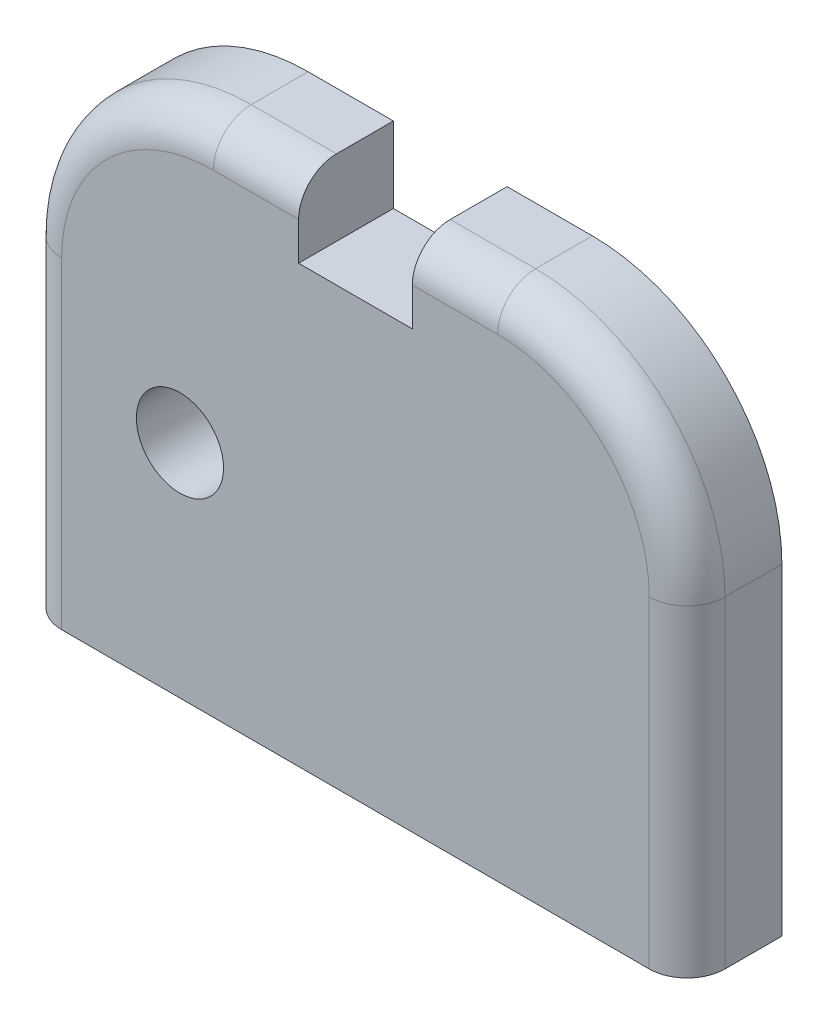
ISO-10303-21;
HEADER;
FILE_DESCRIPTION(('STEP AP214'),'2;1');
FILE_NAME('part.step','',(''),(''),'','','');
FILE_SCHEMA(('AUTOMOTIVE_DESIGN { 1 0 10303 214 1 1 1 1 }'));
ENDSEC;
DATA;
#1=APPLICATION_CONTEXT('core data for automotive mechanical design processes');
#2=APPLICATION_PROTOCOL_DEFINITION('international standard','automotive_design',2000,#1);
#3=PRODUCT_CONTEXT('',#1,'mechanical');
#4=PRODUCT('Part','Part','',(#3));
#5=PRODUCT_RELATED_PRODUCT_CATEGORY('part','',(#4));
#6=PRODUCT_DEFINITION_FORMATION('','',#4);
#7=PRODUCT_DEFINITION_CONTEXT('part definition',#1,'design');
#8=PRODUCT_DEFINITION('design','',#6,#7);
#9=PRODUCT_DEFINITION_SHAPE('','',#8);
#10=(LENGTH_UNIT() NAMED_UNIT(*) SI_UNIT(.MILLI.,.METRE.));
#11=(NAMED_UNIT(*) PLANE_ANGLE_UNIT() SI_UNIT($,.RADIAN.));
#12=(NAMED_UNIT(*) SI_UNIT($,.STERADIAN.) SOLID_ANGLE_UNIT());
#13=UNCERTAINTY_MEASURE_WITH_UNIT(LENGTH_MEASURE(1.E-05),#10,'distance_accuracy_value','');
#14=(GEOMETRIC_REPRESENTATION_CONTEXT(3) GLOBAL_UNCERTAINTY_ASSIGNED_CONTEXT((#13)) GLOBAL_UNIT_ASSIGNED_CONTEXT((#10,
#11,#12)) REPRESENTATION_CONTEXT('',''));
#15=CARTESIAN_POINT('',(0.,0.,0.));
#16=DIRECTION('',(0.,0.,1.));
#17=DIRECTION('',(1.,0.,0.));
#18=AXIS2_PLACEMENT_3D('',#15,#16,#17);
#19=CARTESIAN_POINT('',(3.,13.5,5.));
#20=DIRECTION('',(0.,-1.,0.));
#21=DIRECTION('',(0.,0.,-1.));
#22=AXIS2_PLACEMENT_3D('',#19,#20,#21);
#23=PLANE('',#22);
#24=DIRECTION('',(0.,0.,-1.));
#25=VECTOR('',#24,1.);
#26=CARTESIAN_POINT('',(3.,13.5,5.));
#27=LINE('',#26,#25);
#28=CARTESIAN_POINT('',(3.,13.5,3.));
#29=VERTEX_POINT('',#28);
#30=CARTESIAN_POINT('',(3.,13.5,0.));
#31=VERTEX_POINT('',#30);
#32=EDGE_CURVE('E226',#29,#31,#27,.T.);
#33=ORIENTED_EDGE('',*,*,#32,.F.);
#34=DIRECTION('',(-1.,0.,0.));
#35=VECTOR('',#34,1.);
#36=CARTESIAN_POINT('',(7.5,13.5,3.));
#37=LINE('',#36,#35);
#38=CARTESIAN_POINT('',(7.5,13.5,3.));
#39=VERTEX_POINT('',#38);
#40=EDGE_CURVE('E257',#29,#39,#37,.F.);
#41=ORIENTED_EDGE('',*,*,#40,.T.);
#42=DIRECTION('',(0.,0.,-1.));
#43=VECTOR('',#42,1.);
#44=CARTESIAN_POINT('',(7.5,13.5,5.));
#45=LINE('',#44,#43);
#46=CARTESIAN_POINT('',(7.5,13.5,0.));
#47=VERTEX_POINT('',#46);
#48=EDGE_CURVE('E237',#39,#47,#45,.T.);
#49=ORIENTED_EDGE('',*,*,#48,.T.);
#50=DIRECTION('',(-1.,0.,0.));
#51=VECTOR('',#50,1.);
#52=CARTESIAN_POINT('',(3.,13.5,0.));
#53=LINE('',#52,#51);
#54=EDGE_CURVE('E193',#47,#31,#53,.T.);
#55=ORIENTED_EDGE('',*,*,#54,.T.);
#56=EDGE_LOOP('',(#33,#41,#49,#55));
#57=FACE_BOUND('',#56,.T.);
#58=ADVANCED_FACE('F32',(#57),#23,.F.);
#59=CARTESIAN_POINT('',(3.,13.5,5.));
#60=DIRECTION('',(1.,0.,0.));
#61=DIRECTION('',(0.,1.,0.));
#62=AXIS2_PLACEMENT_3D('',#59,#60,#61);
#63=PLANE('',#62);
#64=DIRECTION('',(0.,-1.,0.));
#65=VECTOR('',#64,1.);
#66=CARTESIAN_POINT('',(3.,13.5,5.));
#67=LINE('',#66,#65);
#68=CARTESIAN_POINT('',(3.,11.5,5.));
#69=VERTEX_POINT('',#68);
#70=CARTESIAN_POINT('',(3.,9.50000000000001,5.));
#71=VERTEX_POINT('',#70);
#72=EDGE_CURVE('E181',#69,#71,#67,.T.);
#73=ORIENTED_EDGE('',*,*,#72,.F.);
#74=CARTESIAN_POINT('',(3.,11.5,3.));
#75=DIRECTION('',(1.,0.,0.));
#76=DIRECTION('',(0.,1.,0.));
#77=AXIS2_PLACEMENT_3D('',#74,#75,#76);
#78=CIRCLE('',#77,2.);
#79=EDGE_CURVE('E255',#69,#29,#78,.F.);
#80=ORIENTED_EDGE('',*,*,#79,.T.);
#81=ORIENTED_EDGE('',*,*,#32,.T.);
#82=DIRECTION('',(0.,-1.,0.));
#83=VECTOR('',#82,1.);
#84=CARTESIAN_POINT('',(3.,13.5,0.));
#85=LINE('',#84,#83);
#86=CARTESIAN_POINT('',(3.,9.50000000000001,0.));
#87=VERTEX_POINT('',#86);
#88=EDGE_CURVE('E196',#31,#87,#85,.T.);
#89=ORIENTED_EDGE('',*,*,#88,.T.);
#90=DIRECTION('',(0.,0.,-1.));
#91=VECTOR('',#90,1.);
#92=CARTESIAN_POINT('',(3.,9.50000000000001,5.));
#93=LINE('',#92,#91);
#94=EDGE_CURVE('E223',#71,#87,#93,.T.);
#95=ORIENTED_EDGE('',*,*,#94,.F.);
#96=EDGE_LOOP('',(#73,#80,#81,#89,#95));
#97=FACE_BOUND('',#96,.T.);
#98=ADVANCED_FACE('F309',(#97),#63,.F.);
#99=CARTESIAN_POINT('',(3.,9.50000000000001,5.));
#100=DIRECTION('',(0.,-1.,0.));
#101=DIRECTION('',(0.,0.,-1.));
#102=AXIS2_PLACEMENT_3D('',#99,#100,#101);
#103=PLANE('',#102);
#104=DIRECTION('',(-1.,0.,0.));
#105=VECTOR('',#104,1.);
#106=CARTESIAN_POINT('',(3.,9.50000000000001,0.));
#107=LINE('',#106,#105);
#108=CARTESIAN_POINT('',(-3.00000000000001,9.50000000000001,0.));
#109=VERTEX_POINT('',#108);
#110=EDGE_CURVE('E199',#87,#109,#107,.T.);
#111=ORIENTED_EDGE('',*,*,#110,.T.);
#112=DIRECTION('',(0.,0.,-1.));
#113=VECTOR('',#112,1.);
#114=CARTESIAN_POINT('',(-3.00000000000001,9.50000000000001,5.));
#115=LINE('',#114,#113);
#116=CARTESIAN_POINT('',(-3.00000000000001,9.50000000000001,5.));
#117=VERTEX_POINT('',#116);
#118=EDGE_CURVE('E220',#117,#109,#115,.T.);
#119=ORIENTED_EDGE('',*,*,#118,.F.);
#120=DIRECTION('',(-1.,0.,0.));
#121=VECTOR('',#120,1.);
#122=CARTESIAN_POINT('',(3.,9.50000000000001,5.));
#123=LINE('',#122,#121);
#124=EDGE_CURVE('E183',#71,#117,#123,.T.);
#125=ORIENTED_EDGE('',*,*,#124,.F.);
#126=ORIENTED_EDGE('',*,*,#94,.T.);
#127=EDGE_LOOP('',(#111,#119,#125,#126));
#128=FACE_BOUND('',#127,.T.);
#129=ADVANCED_FACE('F315',(#128),#103,.F.);
#130=CARTESIAN_POINT('',(-3.00000000000001,9.50000000000001,5.));
#131=DIRECTION('',(-1.,0.,0.));
#132=DIRECTION('',(0.,0.,1.));
#133=AXIS2_PLACEMENT_3D('',#130,#131,#132);
#134=PLANE('',#133);
#135=DIRECTION('',(0.,0.,-1.));
#136=VECTOR('',#135,1.);
#137=CARTESIAN_POINT('',(-3.00000000000001,13.5,5.));
#138=LINE('',#137,#136);
#139=CARTESIAN_POINT('',(-3.00000000000001,13.5,3.));
#140=VERTEX_POINT('',#139);
#141=CARTESIAN_POINT('',(-3.00000000000001,13.5,0.));
#142=VERTEX_POINT('',#141);
#143=EDGE_CURVE('E218',#140,#142,#138,.T.);
#144=ORIENTED_EDGE('',*,*,#143,.F.);
#145=CARTESIAN_POINT('',(-3.00000000000001,11.5,3.));
#146=DIRECTION('',(-1.,0.,0.));
#147=DIRECTION('',(0.,0.,1.));
#148=AXIS2_PLACEMENT_3D('',#145,#146,#147);
#149=CIRCLE('',#148,2.);
#150=CARTESIAN_POINT('',(-3.00000000000001,11.5,5.));
#151=VERTEX_POINT('',#150);
#152=EDGE_CURVE('E263',#140,#151,#149,.F.);
#153=ORIENTED_EDGE('',*,*,#152,.T.);
#154=DIRECTION('',(0.,1.,0.));
#155=VECTOR('',#154,1.);
#156=CARTESIAN_POINT('',(-3.00000000000001,9.50000000000001,5.));
#157=LINE('',#156,#155);
#158=EDGE_CURVE('E186',#117,#151,#157,.T.);
#159=ORIENTED_EDGE('',*,*,#158,.F.);
#160=ORIENTED_EDGE('',*,*,#118,.T.);
#161=DIRECTION('',(0.,1.,0.));
#162=VECTOR('',#161,1.);
#163=CARTESIAN_POINT('',(-3.00000000000001,9.50000000000001,0.));
#164=LINE('',#163,#162);
#165=EDGE_CURVE('E201',#109,#142,#164,.T.);
#166=ORIENTED_EDGE('',*,*,#165,.T.);
#167=EDGE_LOOP('',(#144,#153,#159,#160,#166));
#168=FACE_BOUND('',#167,.T.);
#169=ADVANCED_FACE('F384',(#168),#134,.F.);
#170=CARTESIAN_POINT('',(-17.5,13.5,5.));
#171=DIRECTION('',(0.,-1.,0.));
#172=DIRECTION('',(0.,0.,-1.));
#173=AXIS2_PLACEMENT_3D('',#170,#171,#172);
#174=PLANE('',#173);
#175=DIRECTION('',(0.,0.,-1.));
#176=VECTOR('',#175,1.);
#177=CARTESIAN_POINT('',(-7.50000000000001,13.5,5.));
#178=LINE('',#177,#176);
#179=CARTESIAN_POINT('',(-7.50000000000001,13.5,0.));
#180=VERTEX_POINT('',#179);
#181=CARTESIAN_POINT('',(-7.50000000000001,13.5,3.));
#182=VERTEX_POINT('',#181);
#183=EDGE_CURVE('E234',#180,#182,#178,.F.);
#184=ORIENTED_EDGE('',*,*,#183,.T.);
#185=DIRECTION('',(-1.,0.,0.));
#186=VECTOR('',#185,1.);
#187=CARTESIAN_POINT('',(-3.00000000000001,13.5,3.));
#188=LINE('',#187,#186);
#189=EDGE_CURVE('E261',#182,#140,#188,.F.);
#190=ORIENTED_EDGE('',*,*,#189,.T.);
#191=ORIENTED_EDGE('',*,*,#143,.T.);
#192=DIRECTION('',(-1.,0.,0.));
#193=VECTOR('',#192,1.);
#194=CARTESIAN_POINT('',(-17.5,13.5,0.));
#195=LINE('',#194,#193);
#196=EDGE_CURVE('E204',#142,#180,#195,.T.);
#197=ORIENTED_EDGE('',*,*,#196,.T.);
#198=EDGE_LOOP('',(#184,#190,#191,#197));
#199=FACE_BOUND('',#198,.T.);
#200=ADVANCED_FACE('F382',(#199),#174,.F.);
#201=CARTESIAN_POINT('',(-17.5,-13.5,5.));
#202=DIRECTION('',(1.,0.,0.));
#203=DIRECTION('',(0.,0.,-1.));
#204=AXIS2_PLACEMENT_3D('',#201,#202,#203);
#205=PLANE('',#204);
#206=DIRECTION('',(0.,0.,-1.));
#207=VECTOR('',#206,1.);
#208=CARTESIAN_POINT('',(-17.5,-13.5,5.));
#209=LINE('',#208,#207);
#210=CARTESIAN_POINT('',(-17.5,-13.5,3.));
#211=VERTEX_POINT('',#210);
#212=CARTESIAN_POINT('',(-17.5,-13.5,0.));
#213=VERTEX_POINT('',#212);
#214=EDGE_CURVE('E216',#211,#213,#209,.T.);
#215=ORIENTED_EDGE('',*,*,#214,.F.);
#216=DIRECTION('',(0.,-1.,0.));
#217=VECTOR('',#216,1.);
#218=CARTESIAN_POINT('',(-17.5,3.5,3.));
#219=LINE('',#218,#217);
#220=CARTESIAN_POINT('',(-17.5,3.5,3.));
#221=VERTEX_POINT('',#220);
#222=EDGE_CURVE('E271',#211,#221,#219,.F.);
#223=ORIENTED_EDGE('',*,*,#222,.T.);
#224=DIRECTION('',(0.,0.,-1.));
#225=VECTOR('',#224,1.);
#226=CARTESIAN_POINT('',(-17.5,3.5,5.));
#227=LINE('',#226,#225);
#228=CARTESIAN_POINT('',(-17.5,3.5,0.));
#229=VERTEX_POINT('',#228);
#230=EDGE_CURVE('E228',#221,#229,#227,.T.);
#231=ORIENTED_EDGE('',*,*,#230,.T.);
#232=DIRECTION('',(0.,-1.,0.));
#233=VECTOR('',#232,1.);
#234=CARTESIAN_POINT('',(-17.5,-13.5,0.));
#235=LINE('',#234,#233);
#236=EDGE_CURVE('E207',#229,#213,#235,.T.);
#237=ORIENTED_EDGE('',*,*,#236,.T.);
#238=EDGE_LOOP('',(#215,#223,#231,#237));
#239=FACE_BOUND('',#238,.T.);
#240=ADVANCED_FACE('F360',(#239),#205,.F.);
#241=CARTESIAN_POINT('',(-17.5,-13.5,5.));
#242=DIRECTION('',(0.,1.,0.));
#243=DIRECTION('',(0.,0.,1.));
#244=AXIS2_PLACEMENT_3D('',#241,#242,#243);
#245=PLANE('',#244);
#246=CARTESIAN_POINT('',(10.0074566894335,-13.5,2.50523650697441));
#247=DIRECTION('',(0.,-1.,0.));
#248=DIRECTION('',(0.,0.,-1.));
#249=AXIS2_PLACEMENT_3D('',#246,#247,#248);
#250=CIRCLE('',#249,0.79999999999999);
#251=CARTESIAN_POINT('',(10.0074566894335,-13.5,1.70523650697442));
#252=VERTEX_POINT('',#251);
#253=EDGE_CURVE('E153',#252,#252,#250,.T.);
#254=ORIENTED_EDGE('',*,*,#253,.F.);
#255=EDGE_LOOP('',(#254));
#256=FACE_BOUND('',#255,.T.);
#257=CARTESIAN_POINT('',(0.,-13.5,2.50523650697441));
#258=DIRECTION('',(0.,-1.,0.));
#259=DIRECTION('',(0.,0.,-1.));
#260=AXIS2_PLACEMENT_3D('',#257,#258,#259);
#261=CIRCLE('',#260,0.79999999999999);
#262=CARTESIAN_POINT('',(0.,-13.5,1.70523650697442));
#263=VERTEX_POINT('',#262);
#264=EDGE_CURVE('E152',#263,#263,#261,.T.);
#265=ORIENTED_EDGE('',*,*,#264,.F.);
#266=EDGE_LOOP('',(#265));
#267=FACE_BOUND('',#266,.T.);
#268=CARTESIAN_POINT('',(-10.,-13.5,2.5));
#269=DIRECTION('',(0.,-1.,0.));
#270=DIRECTION('',(0.,0.,-1.));
#271=AXIS2_PLACEMENT_3D('',#268,#269,#270);
#272=CIRCLE('',#271,0.79999999999999);
#273=CARTESIAN_POINT('',(-10.,-13.5,1.70000000000001));
#274=VERTEX_POINT('',#273);
#275=EDGE_CURVE('E165',#274,#274,#272,.T.);
#276=ORIENTED_EDGE('',*,*,#275,.F.);
#277=EDGE_LOOP('',(#276));
#278=FACE_BOUND('',#277,.T.);
#279=DIRECTION('',(0.,0.,-1.));
#280=VECTOR('',#279,1.);
#281=CARTESIAN_POINT('',(17.5,-13.5,5.));
#282=LINE('',#281,#280);
#283=CARTESIAN_POINT('',(17.5,-13.5,3.));
#284=VERTEX_POINT('',#283);
#285=CARTESIAN_POINT('',(17.5,-13.5,0.));
#286=VERTEX_POINT('',#285);
#287=EDGE_CURVE('E192',#284,#286,#282,.T.);
#288=ORIENTED_EDGE('',*,*,#287,.F.);
#289=CARTESIAN_POINT('',(15.5,-13.5,3.));
#290=DIRECTION('',(0.,1.,0.));
#291=DIRECTION('',(0.,0.,1.));
#292=AXIS2_PLACEMENT_3D('',#289,#290,#291);
#293=CIRCLE('',#292,2.);
#294=CARTESIAN_POINT('',(15.5,-13.5,5.));
#295=VERTEX_POINT('',#294);
#296=EDGE_CURVE('E269',#284,#295,#293,.F.);
#297=ORIENTED_EDGE('',*,*,#296,.T.);
#298=DIRECTION('',(1.,0.,0.));
#299=VECTOR('',#298,1.);
#300=CARTESIAN_POINT('',(-17.5,-13.5,5.));
#301=LINE('',#300,#299);
#302=CARTESIAN_POINT('',(-15.5,-13.5,5.));
#303=VERTEX_POINT('',#302);
#304=EDGE_CURVE('E189',#303,#295,#301,.T.);
#305=ORIENTED_EDGE('',*,*,#304,.F.);
#306=CARTESIAN_POINT('',(-15.5,-13.5,3.));
#307=DIRECTION('',(0.,1.,0.));
#308=DIRECTION('',(0.,0.,1.));
#309=AXIS2_PLACEMENT_3D('',#306,#307,#308);
#310=CIRCLE('',#309,2.);
#311=EDGE_CURVE('E47',#303,#211,#310,.F.);
#312=ORIENTED_EDGE('',*,*,#311,.T.);
#313=ORIENTED_EDGE('',*,*,#214,.T.);
#314=DIRECTION('',(1.,0.,0.));
#315=VECTOR('',#314,1.);
#316=CARTESIAN_POINT('',(-17.5,-13.5,0.));
#317=LINE('',#316,#315);
#318=EDGE_CURVE('E210',#213,#286,#317,.T.);
#319=ORIENTED_EDGE('',*,*,#318,.T.);
#320=EDGE_LOOP('',(#288,#297,#305,#312,#313,#319));
#321=FACE_BOUND('',#320,.T.);
#322=ADVANCED_FACE('F367',(#256,#267,#278,#321),#245,.F.);
#323=CARTESIAN_POINT('',(17.5,-13.5,5.));
#324=DIRECTION('',(-1.,0.,0.));
#325=DIRECTION('',(0.,0.,1.));
#326=AXIS2_PLACEMENT_3D('',#323,#324,#325);
#327=PLANE('',#326);
#328=DIRECTION('',(0.,0.,-1.));
#329=VECTOR('',#328,1.);
#330=CARTESIAN_POINT('',(17.5,3.5,5.));
#331=LINE('',#330,#329);
#332=CARTESIAN_POINT('',(17.5,3.5,0.));
#333=VERTEX_POINT('',#332);
#334=CARTESIAN_POINT('',(17.5,3.5,3.));
#335=VERTEX_POINT('',#334);
#336=EDGE_CURVE('E239',#333,#335,#331,.F.);
#337=ORIENTED_EDGE('',*,*,#336,.T.);
#338=DIRECTION('',(0.,1.,0.));
#339=VECTOR('',#338,1.);
#340=CARTESIAN_POINT('',(17.5,-13.5,3.));
#341=LINE('',#340,#339);
#342=EDGE_CURVE('E55',#335,#284,#341,.F.);
#343=ORIENTED_EDGE('',*,*,#342,.T.);
#344=ORIENTED_EDGE('',*,*,#287,.T.);
#345=DIRECTION('',(0.,1.,0.));
#346=VECTOR('',#345,1.);
#347=CARTESIAN_POINT('',(17.5,-13.5,0.));
#348=LINE('',#347,#346);
#349=EDGE_CURVE('E184',#286,#333,#348,.T.);
#350=ORIENTED_EDGE('',*,*,#349,.T.);
#351=EDGE_LOOP('',(#337,#343,#344,#350));
#352=FACE_BOUND('',#351,.T.);
#353=ADVANCED_FACE('F399',(#352),#327,.F.);
#354=CARTESIAN_POINT('',(0.,0.,5.));
#355=DIRECTION('',(0.,0.,1.));
#356=DIRECTION('',(1.,0.,0.));
#357=AXIS2_PLACEMENT_3D('',#354,#355,#356);
#358=PLANE('',#357);
#359=CARTESIAN_POINT('',(-9.26139285365163,-1.8403913808745,5.));
#360=DIRECTION('',(0.,0.,1.));
#361=DIRECTION('',(1.,0.,0.));
#362=AXIS2_PLACEMENT_3D('',#359,#360,#361);
#363=CIRCLE('',#362,2.3);
#364=CARTESIAN_POINT('',(-6.96139285365163,-1.8403913808745,5.));
#365=VERTEX_POINT('',#364);
#366=EDGE_CURVE('E615',#365,#365,#363,.T.);
#367=ORIENTED_EDGE('',*,*,#366,.F.);
#368=EDGE_LOOP('',(#367));
#369=FACE_BOUND('',#368,.T.);
#370=CARTESIAN_POINT('',(7.5,3.5,5.));
#371=DIRECTION('',(0.,0.,1.));
#372=DIRECTION('',(1.,0.,0.));
#373=AXIS2_PLACEMENT_3D('',#370,#371,#372);
#374=CIRCLE('',#373,8.);
#375=CARTESIAN_POINT('',(15.5,3.5,5.));
#376=VERTEX_POINT('',#375);
#377=CARTESIAN_POINT('',(7.5,11.5,5.));
#378=VERTEX_POINT('',#377);
#379=EDGE_CURVE('E250',#376,#378,#374,.T.);
#380=ORIENTED_EDGE('',*,*,#379,.T.);
#381=DIRECTION('',(-1.,0.,0.));
#382=VECTOR('',#381,1.);
#383=CARTESIAN_POINT('',(3.,11.5,5.));
#384=LINE('',#383,#382);
#385=EDGE_CURVE('E252',#378,#69,#384,.T.);
#386=ORIENTED_EDGE('',*,*,#385,.T.);
#387=ORIENTED_EDGE('',*,*,#72,.T.);
#388=ORIENTED_EDGE('',*,*,#124,.T.);
#389=ORIENTED_EDGE('',*,*,#158,.T.);
#390=DIRECTION('',(-1.,0.,0.));
#391=VECTOR('',#390,1.);
#392=CARTESIAN_POINT('',(-7.50000000000001,11.5,5.));
#393=LINE('',#392,#391);
#394=CARTESIAN_POINT('',(-7.50000000000001,11.5,5.));
#395=VERTEX_POINT('',#394);
#396=EDGE_CURVE('E245',#151,#395,#393,.T.);
#397=ORIENTED_EDGE('',*,*,#396,.T.);
#398=CARTESIAN_POINT('',(-7.50000000000001,3.5,5.));
#399=DIRECTION('',(0.,0.,1.));
#400=DIRECTION('',(1.,0.,0.));
#401=AXIS2_PLACEMENT_3D('',#398,#399,#400);
#402=CIRCLE('',#401,8.);
#403=CARTESIAN_POINT('',(-15.5,3.5,5.));
#404=VERTEX_POINT('',#403);
#405=EDGE_CURVE('E243',#395,#404,#402,.T.);
#406=ORIENTED_EDGE('',*,*,#405,.T.);
#407=DIRECTION('',(0.,-1.,0.));
#408=VECTOR('',#407,1.);
#409=CARTESIAN_POINT('',(-15.5,-13.5,5.));
#410=LINE('',#409,#408);
#411=EDGE_CURVE('E241',#404,#303,#410,.T.);
#412=ORIENTED_EDGE('',*,*,#411,.T.);
#413=ORIENTED_EDGE('',*,*,#304,.T.);
#414=DIRECTION('',(0.,1.,0.));
#415=VECTOR('',#414,1.);
#416=CARTESIAN_POINT('',(15.5,3.5,5.));
#417=LINE('',#416,#415);
#418=EDGE_CURVE('E248',#295,#376,#417,.T.);
#419=ORIENTED_EDGE('',*,*,#418,.T.);
#420=EDGE_LOOP('',(#380,#386,#387,#388,#389,#397,#406,#412,#413,#419));
#421=FACE_BOUND('',#420,.T.);
#422=ADVANCED_FACE('F373',(#369,#421),#358,.T.);
#423=CARTESIAN_POINT('',(0.,0.,0.));
#424=DIRECTION('',(0.,0.,1.));
#425=DIRECTION('',(1.,0.,0.));
#426=AXIS2_PLACEMENT_3D('',#423,#424,#425);
#427=PLANE('',#426);
#428=CARTESIAN_POINT('',(-9.26139285365163,-1.8403913808745,0.));
#429=DIRECTION('',(0.,0.,1.));
#430=DIRECTION('',(1.,0.,0.));
#431=AXIS2_PLACEMENT_3D('',#428,#429,#430);
#432=CIRCLE('',#431,7.91421356237309);
#433=CARTESIAN_POINT('',(-1.34717929127854,-1.8403913808745,0.));
#434=VERTEX_POINT('',#433);
#435=EDGE_CURVE('E11',#434,#434,#432,.T.);
#436=ORIENTED_EDGE('',*,*,#435,.T.);
#437=EDGE_LOOP('',(#436));
#438=FACE_BOUND('',#437,.T.);
#439=CARTESIAN_POINT('',(9.15,-2.,0.));
#440=DIRECTION('',(0.,0.,1.));
#441=DIRECTION('',(1.,0.,0.));
#442=AXIS2_PLACEMENT_3D('',#439,#440,#441);
#443=CIRCLE('',#442,7.6142135623731);
#444=CARTESIAN_POINT('',(16.7642135623731,-2.,0.));
#445=VERTEX_POINT('',#444);
#446=EDGE_CURVE('E40',#445,#445,#443,.T.);
#447=ORIENTED_EDGE('',*,*,#446,.T.);
#448=EDGE_LOOP('',(#447));
#449=FACE_BOUND('',#448,.T.);
#450=ORIENTED_EDGE('',*,*,#236,.F.);
#451=CARTESIAN_POINT('',(-7.50000000000001,3.5,0.));
#452=DIRECTION('',(0.,0.,1.));
#453=DIRECTION('',(1.,0.,0.));
#454=AXIS2_PLACEMENT_3D('',#451,#452,#453);
#455=CIRCLE('',#454,10.);
#456=EDGE_CURVE('E232',#229,#180,#455,.F.);
#457=ORIENTED_EDGE('',*,*,#456,.T.);
#458=ORIENTED_EDGE('',*,*,#196,.F.);
#459=ORIENTED_EDGE('',*,*,#165,.F.);
#460=ORIENTED_EDGE('',*,*,#110,.F.);
#461=ORIENTED_EDGE('',*,*,#88,.F.);
#462=ORIENTED_EDGE('',*,*,#54,.F.);
#463=CARTESIAN_POINT('',(7.5,3.5,0.));
#464=DIRECTION('',(0.,0.,1.));
#465=DIRECTION('',(1.,0.,0.));
#466=AXIS2_PLACEMENT_3D('',#463,#464,#465);
#467=CIRCLE('',#466,10.);
#468=EDGE_CURVE('E230',#47,#333,#467,.F.);
#469=ORIENTED_EDGE('',*,*,#468,.T.);
#470=ORIENTED_EDGE('',*,*,#349,.F.);
#471=ORIENTED_EDGE('',*,*,#318,.F.);
#472=EDGE_LOOP('',(#450,#457,#458,#459,#460,#461,#462,#469,#470,#471));
#473=FACE_BOUND('',#472,.T.);
#474=ADVANCED_FACE('F284',(#438,#449,#473),#427,.F.);
#475=CARTESIAN_POINT('',(-7.50000000000001,3.5,5.));
#476=DIRECTION('',(0.,0.,-1.));
#477=DIRECTION('',(-1.,0.,0.));
#478=AXIS2_PLACEMENT_3D('',#475,#476,#477);
#479=CYLINDRICAL_SURFACE('',#478,10.);
#480=ORIENTED_EDGE('',*,*,#230,.F.);
#481=CARTESIAN_POINT('',(-7.50000000000001,3.5,3.));
#482=DIRECTION('',(0.,0.,1.));
#483=DIRECTION('',(1.,0.,0.));
#484=AXIS2_PLACEMENT_3D('',#481,#482,#483);
#485=CIRCLE('',#484,10.);
#486=EDGE_CURVE('E265',#221,#182,#485,.F.);
#487=ORIENTED_EDGE('',*,*,#486,.T.);
#488=ORIENTED_EDGE('',*,*,#183,.F.);
#489=ORIENTED_EDGE('',*,*,#456,.F.);
#490=EDGE_LOOP('',(#480,#487,#488,#489));
#491=FACE_BOUND('',#490,.T.);
#492=ADVANCED_FACE('F321',(#491),#479,.T.);
#493=CARTESIAN_POINT('',(7.5,3.5,5.));
#494=DIRECTION('',(0.,0.,-1.));
#495=DIRECTION('',(-1.,0.,0.));
#496=AXIS2_PLACEMENT_3D('',#493,#494,#495);
#497=CYLINDRICAL_SURFACE('',#496,10.);
#498=ORIENTED_EDGE('',*,*,#48,.F.);
#499=CARTESIAN_POINT('',(7.5,3.5,3.));
#500=DIRECTION('',(0.,0.,1.));
#501=DIRECTION('',(1.,0.,0.));
#502=AXIS2_PLACEMENT_3D('',#499,#500,#501);
#503=CIRCLE('',#502,10.);
#504=EDGE_CURVE('E259',#39,#335,#503,.F.);
#505=ORIENTED_EDGE('',*,*,#504,.T.);
#506=ORIENTED_EDGE('',*,*,#336,.F.);
#507=ORIENTED_EDGE('',*,*,#468,.F.);
#508=EDGE_LOOP('',(#498,#505,#506,#507));
#509=FACE_BOUND('',#508,.T.);
#510=ADVANCED_FACE('F324',(#509),#497,.T.);
#511=CARTESIAN_POINT('',(15.5,0.,3.));
#512=DIRECTION('',(0.,-1.,0.));
#513=DIRECTION('',(0.,0.,-1.));
#514=AXIS2_PLACEMENT_3D('',#511,#512,#513);
#515=CYLINDRICAL_SURFACE('',#514,2.);
#516=ORIENTED_EDGE('',*,*,#296,.F.);
#517=ORIENTED_EDGE('',*,*,#342,.F.);
#518=CARTESIAN_POINT('',(15.5,3.5,3.));
#519=DIRECTION('',(0.,1.,0.));
#520=DIRECTION('',(-1.,0.,0.));
#521=AXIS2_PLACEMENT_3D('',#518,#519,#520);
#522=CIRCLE('',#521,2.);
#523=EDGE_CURVE('E197',#376,#335,#522,.T.);
#524=ORIENTED_EDGE('',*,*,#523,.F.);
#525=ORIENTED_EDGE('',*,*,#418,.F.);
#526=EDGE_LOOP('',(#516,#517,#524,#525));
#527=FACE_BOUND('',#526,.T.);
#528=ADVANCED_FACE('F328',(#527),#515,.T.);
#529=CARTESIAN_POINT('',(7.5,3.5,3.));
#530=DIRECTION('',(0.,0.,1.));
#531=DIRECTION('',(1.,0.,0.));
#532=AXIS2_PLACEMENT_3D('',#529,#530,#531);
#533=TOROIDAL_SURFACE('',#532,8.,2.);
#534=ORIENTED_EDGE('',*,*,#523,.T.);
#535=ORIENTED_EDGE('',*,*,#504,.F.);
#536=CARTESIAN_POINT('',(7.5,11.5,3.));
#537=DIRECTION('',(-1.,0.,0.));
#538=DIRECTION('',(0.,0.,1.));
#539=AXIS2_PLACEMENT_3D('',#536,#537,#538);
#540=CIRCLE('',#539,2.);
#541=EDGE_CURVE('E273',#378,#39,#540,.T.);
#542=ORIENTED_EDGE('',*,*,#541,.F.);
#543=ORIENTED_EDGE('',*,*,#379,.F.);
#544=EDGE_LOOP('',(#534,#535,#542,#543));
#545=FACE_BOUND('',#544,.T.);
#546=ADVANCED_FACE('F334',(#545),#533,.T.);
#547=CARTESIAN_POINT('',(0.,11.5,3.));
#548=DIRECTION('',(1.,0.,0.));
#549=DIRECTION('',(0.,0.,-1.));
#550=AXIS2_PLACEMENT_3D('',#547,#548,#549);
#551=CYLINDRICAL_SURFACE('',#550,2.);
#552=ORIENTED_EDGE('',*,*,#541,.T.);
#553=ORIENTED_EDGE('',*,*,#40,.F.);
#554=ORIENTED_EDGE('',*,*,#79,.F.);
#555=ORIENTED_EDGE('',*,*,#385,.F.);
#556=EDGE_LOOP('',(#552,#553,#554,#555));
#557=FACE_BOUND('',#556,.T.);
#558=ADVANCED_FACE('F330',(#557),#551,.T.);
#559=CARTESIAN_POINT('',(-15.5,0.,3.));
#560=DIRECTION('',(0.,1.,0.));
#561=DIRECTION('',(0.,0.,1.));
#562=AXIS2_PLACEMENT_3D('',#559,#560,#561);
#563=CYLINDRICAL_SURFACE('',#562,2.);
#564=ORIENTED_EDGE('',*,*,#311,.F.);
#565=ORIENTED_EDGE('',*,*,#411,.F.);
#566=CARTESIAN_POINT('',(-15.5,3.5,3.));
#567=DIRECTION('',(0.,1.,0.));
#568=DIRECTION('',(0.,0.,1.));
#569=AXIS2_PLACEMENT_3D('',#566,#567,#568);
#570=CIRCLE('',#569,2.);
#571=EDGE_CURVE('E276',#221,#404,#570,.T.);
#572=ORIENTED_EDGE('',*,*,#571,.F.);
#573=ORIENTED_EDGE('',*,*,#222,.F.);
#574=EDGE_LOOP('',(#564,#565,#572,#573));
#575=FACE_BOUND('',#574,.T.);
#576=ADVANCED_FACE('F333',(#575),#563,.T.);
#577=CARTESIAN_POINT('',(-7.50000000000001,3.5,3.));
#578=DIRECTION('',(0.,0.,1.));
#579=DIRECTION('',(1.,0.,0.));
#580=AXIS2_PLACEMENT_3D('',#577,#578,#579);
#581=TOROIDAL_SURFACE('',#580,8.,2.);
#582=ORIENTED_EDGE('',*,*,#571,.T.);
#583=ORIENTED_EDGE('',*,*,#405,.F.);
#584=CARTESIAN_POINT('',(-7.50000000000001,11.5,3.));
#585=DIRECTION('',(1.,0.,0.));
#586=DIRECTION('',(0.,0.,-1.));
#587=AXIS2_PLACEMENT_3D('',#584,#585,#586);
#588=CIRCLE('',#587,2.);
#589=EDGE_CURVE('E180',#182,#395,#588,.T.);
#590=ORIENTED_EDGE('',*,*,#589,.F.);
#591=ORIENTED_EDGE('',*,*,#486,.F.);
#592=EDGE_LOOP('',(#582,#583,#590,#591));
#593=FACE_BOUND('',#592,.T.);
#594=ADVANCED_FACE('F345',(#593),#581,.T.);
#595=CARTESIAN_POINT('',(0.,11.5,3.));
#596=DIRECTION('',(1.,0.,0.));
#597=DIRECTION('',(0.,0.,-1.));
#598=AXIS2_PLACEMENT_3D('',#595,#596,#597);
#599=CYLINDRICAL_SURFACE('',#598,2.);
#600=ORIENTED_EDGE('',*,*,#152,.F.);
#601=ORIENTED_EDGE('',*,*,#189,.F.);
#602=ORIENTED_EDGE('',*,*,#589,.T.);
#603=ORIENTED_EDGE('',*,*,#396,.F.);
#604=EDGE_LOOP('',(#600,#601,#602,#603));
#605=FACE_BOUND('',#604,.T.);
#606=ADVANCED_FACE('F342',(#605),#599,.T.);
#607=CARTESIAN_POINT('',(-9.26139285365163,-1.8403913808745,-1.));
#608=DIRECTION('',(0.,0.,-1.));
#609=DIRECTION('',(-1.,0.,0.));
#610=AXIS2_PLACEMENT_3D('',#607,#608,#609);
#611=PLANE('',#610);
#612=CARTESIAN_POINT('',(-9.26139285365163,-1.8403913808745,-1.));
#613=DIRECTION('',(0.,0.,-1.));
#614=DIRECTION('',(-1.,0.,0.));
#615=AXIS2_PLACEMENT_3D('',#612,#613,#614);
#616=CIRCLE('',#615,6.5);
#617=CARTESIAN_POINT('',(-15.7613928536516,-1.8403913808745,-1.));
#618=VERTEX_POINT('',#617);
#619=EDGE_CURVE('E177',#618,#618,#616,.T.);
#620=ORIENTED_EDGE('',*,*,#619,.T.);
#621=EDGE_LOOP('',(#620));
#622=FACE_BOUND('',#621,.T.);
#623=CARTESIAN_POINT('',(-9.26139285365163,-1.8403913808745,-1.));
#624=DIRECTION('',(0.,0.,-1.));
#625=DIRECTION('',(-1.,0.,0.));
#626=AXIS2_PLACEMENT_3D('',#623,#624,#625);
#627=CIRCLE('',#626,2.3);
#628=CARTESIAN_POINT('',(-11.5613928536516,-1.8403913808745,-1.));
#629=VERTEX_POINT('',#628);
#630=EDGE_CURVE('E174',#629,#629,#627,.T.);
#631=ORIENTED_EDGE('',*,*,#630,.F.);
#632=EDGE_LOOP('',(#631));
#633=FACE_BOUND('',#632,.T.);
#634=ADVANCED_FACE('F303',(#622,#633),#611,.T.);
#635=CARTESIAN_POINT('',(-9.26139285365163,-1.8403913808745,-1.));
#636=DIRECTION('',(0.,0.,1.));
#637=DIRECTION('',(1.,0.,0.));
#638=AXIS2_PLACEMENT_3D('',#635,#636,#637);
#639=CYLINDRICAL_SURFACE('',#638,2.3);
#640=ORIENTED_EDGE('',*,*,#630,.T.);
#641=EDGE_LOOP('',(#640));
#642=FACE_BOUND('',#641,.T.);
#643=ORIENTED_EDGE('',*,*,#366,.T.);
#644=EDGE_LOOP('',(#643));
#645=FACE_BOUND('',#644,.T.);
#646=ADVANCED_FACE('F295',(#642,#645),#639,.F.);
#647=CARTESIAN_POINT('',(9.15,-2.,-1.));
#648=DIRECTION('',(0.,0.,-1.));
#649=DIRECTION('',(-1.,0.,0.));
#650=AXIS2_PLACEMENT_3D('',#647,#648,#649);
#651=PLANE('',#650);
#652=CARTESIAN_POINT('',(9.15,-2.,-1.));
#653=DIRECTION('',(0.,0.,-1.));
#654=DIRECTION('',(-1.,0.,0.));
#655=AXIS2_PLACEMENT_3D('',#652,#653,#654);
#656=CIRCLE('',#655,2.3);
#657=CARTESIAN_POINT('',(6.85,-2.,-1.));
#658=VERTEX_POINT('',#657);
#659=EDGE_CURVE('E616',#658,#658,#656,.T.);
#660=ORIENTED_EDGE('',*,*,#659,.F.);
#661=EDGE_LOOP('',(#660));
#662=FACE_BOUND('',#661,.T.);
#663=CARTESIAN_POINT('',(9.15,-2.,-1.));
#664=DIRECTION('',(0.,0.,-1.));
#665=DIRECTION('',(-1.,0.,0.));
#666=AXIS2_PLACEMENT_3D('',#663,#664,#665);
#667=CIRCLE('',#666,6.2);
#668=CARTESIAN_POINT('',(2.95,-2.,-1.));
#669=VERTEX_POINT('',#668);
#670=EDGE_CURVE('E171',#669,#669,#667,.T.);
#671=ORIENTED_EDGE('',*,*,#670,.T.);
#672=EDGE_LOOP('',(#671));
#673=FACE_BOUND('',#672,.T.);
#674=ADVANCED_FACE('F293',(#662,#673),#651,.T.);
#675=CARTESIAN_POINT('',(-9.26139285365163,-1.8403913808745,-1.5));
#676=DIRECTION('',(0.,0.,1.));
#677=DIRECTION('',(1.,0.,0.));
#678=AXIS2_PLACEMENT_3D('',#675,#676,#677);
#679=TOROIDAL_SURFACE('',#678,7.91421356237309,1.5);
#680=ORIENTED_EDGE('',*,*,#435,.F.);
#681=EDGE_LOOP('',(#680));
#682=FACE_BOUND('',#681,.T.);
#683=ORIENTED_EDGE('',*,*,#619,.F.);
#684=EDGE_LOOP('',(#683));
#685=FACE_BOUND('',#684,.T.);
#686=ADVANCED_FACE('F290',(#682,#685),#679,.F.);
#687=CARTESIAN_POINT('',(9.15,-2.,-1.5));
#688=DIRECTION('',(0.,0.,1.));
#689=DIRECTION('',(1.,0.,0.));
#690=AXIS2_PLACEMENT_3D('',#687,#688,#689);
#691=TOROIDAL_SURFACE('',#690,7.6142135623731,1.5);
#692=ORIENTED_EDGE('',*,*,#446,.F.);
#693=EDGE_LOOP('',(#692));
#694=FACE_BOUND('',#693,.T.);
#695=ORIENTED_EDGE('',*,*,#670,.F.);
#696=EDGE_LOOP('',(#695));
#697=FACE_BOUND('',#696,.T.);
#698=ADVANCED_FACE('F34',(#694,#697),#691,.F.);
#699=CARTESIAN_POINT('',(-10.,-9.5,2.5));
#700=DIRECTION('',(0.,-1.,0.));
#701=DIRECTION('',(0.,0.,-1.));
#702=AXIS2_PLACEMENT_3D('',#699,#700,#701);
#703=CONICAL_SURFACE('',#702,0.799999999999993,1.02974425867665);
#704=CARTESIAN_POINT('',(-10.,-9.01931150477795,2.5));
#705=VERTEX_POINT('',#704);
#706=VERTEX_LOOP('',#705);
#707=FACE_BOUND('',#706,.T.);
#708=CARTESIAN_POINT('',(-10.,-9.5,2.5));
#709=DIRECTION('',(0.,-1.,0.));
#710=DIRECTION('',(0.,0.,-1.));
#711=AXIS2_PLACEMENT_3D('',#708,#709,#710);
#712=CIRCLE('',#711,0.799999999999993);
#713=CARTESIAN_POINT('',(-10.,-9.5,1.70000000000001));
#714=VERTEX_POINT('',#713);
#715=EDGE_CURVE('E168',#714,#714,#712,.T.);
#716=ORIENTED_EDGE('',*,*,#715,.T.);
#717=EDGE_LOOP('',(#716));
#718=FACE_BOUND('',#717,.T.);
#719=ADVANCED_FACE('F289',(#707,#718),#703,.F.);
#720=CARTESIAN_POINT('',(-10.,-13.5,2.5));
#721=DIRECTION('',(0.,-1.,0.));
#722=DIRECTION('',(0.,0.,-1.));
#723=AXIS2_PLACEMENT_3D('',#720,#721,#722);
#724=CYLINDRICAL_SURFACE('',#723,0.799999999999992);
#725=ORIENTED_EDGE('',*,*,#715,.F.);
#726=EDGE_LOOP('',(#725));
#727=FACE_BOUND('',#726,.T.);
#728=ORIENTED_EDGE('',*,*,#275,.T.);
#729=EDGE_LOOP('',(#728));
#730=FACE_BOUND('',#729,.T.);
#731=ADVANCED_FACE('F454',(#727,#730),#724,.F.);
#732=CARTESIAN_POINT('',(0.,-9.5,2.50523650697441));
#733=DIRECTION('',(0.,-1.,0.));
#734=DIRECTION('',(0.,0.,-1.));
#735=AXIS2_PLACEMENT_3D('',#732,#733,#734);
#736=CONICAL_SURFACE('',#735,0.799999999999993,1.02974425867665);
#737=CARTESIAN_POINT('',(0.,-9.01931150477795,2.50523650697441));
#738=VERTEX_POINT('',#737);
#739=VERTEX_LOOP('',#738);
#740=FACE_BOUND('',#739,.T.);
#741=CARTESIAN_POINT('',(0.,-9.5,2.50523650697441));
#742=DIRECTION('',(0.,-1.,0.));
#743=DIRECTION('',(0.,0.,-1.));
#744=AXIS2_PLACEMENT_3D('',#741,#742,#743);
#745=CIRCLE('',#744,0.799999999999993);
#746=CARTESIAN_POINT('',(0.,-9.5,1.70523650697442));
#747=VERTEX_POINT('',#746);
#748=EDGE_CURVE('E156',#747,#747,#745,.T.);
#749=ORIENTED_EDGE('',*,*,#748,.T.);
#750=EDGE_LOOP('',(#749));
#751=FACE_BOUND('',#750,.T.);
#752=ADVANCED_FACE('F463',(#740,#751),#736,.F.);
#753=CARTESIAN_POINT('',(0.,-13.5,2.50523650697441));
#754=DIRECTION('',(0.,-1.,0.));
#755=DIRECTION('',(0.,0.,-1.));
#756=AXIS2_PLACEMENT_3D('',#753,#754,#755);
#757=CYLINDRICAL_SURFACE('',#756,0.799999999999992);
#758=ORIENTED_EDGE('',*,*,#748,.F.);
#759=EDGE_LOOP('',(#758));
#760=FACE_BOUND('',#759,.T.);
#761=ORIENTED_EDGE('',*,*,#264,.T.);
#762=EDGE_LOOP('',(#761));
#763=FACE_BOUND('',#762,.T.);
#764=ADVANCED_FACE('F146',(#760,#763),#757,.F.);
#765=CARTESIAN_POINT('',(10.0074566894335,-9.5,2.50523650697441));
#766=DIRECTION('',(0.,-1.,0.));
#767=DIRECTION('',(0.,0.,-1.));
#768=AXIS2_PLACEMENT_3D('',#765,#766,#767);
#769=CONICAL_SURFACE('',#768,0.799999999999993,1.02974425867665);
#770=CARTESIAN_POINT('',(10.0074566894335,-9.01931150477795,2.50523650697441));
#771=VERTEX_POINT('',#770);
#772=VERTEX_LOOP('',#771);
#773=FACE_BOUND('',#772,.T.);
#774=CARTESIAN_POINT('',(10.0074566894335,-9.5,2.50523650697441));
#775=DIRECTION('',(0.,-1.,0.));
#776=DIRECTION('',(0.,0.,-1.));
#777=AXIS2_PLACEMENT_3D('',#774,#775,#776);
#778=CIRCLE('',#777,0.799999999999993);
#779=CARTESIAN_POINT('',(10.0074566894335,-9.5,1.70523650697442));
#780=VERTEX_POINT('',#779);
#781=EDGE_CURVE('E150',#780,#780,#778,.T.);
#782=ORIENTED_EDGE('',*,*,#781,.T.);
#783=EDGE_LOOP('',(#782));
#784=FACE_BOUND('',#783,.T.);
#785=ADVANCED_FACE('F142',(#773,#784),#769,.F.);
#786=CARTESIAN_POINT('',(10.0074566894335,-13.5,2.50523650697441));
#787=DIRECTION('',(0.,-1.,0.));
#788=DIRECTION('',(0.,0.,-1.));
#789=AXIS2_PLACEMENT_3D('',#786,#787,#788);
#790=CYLINDRICAL_SURFACE('',#789,0.799999999999992);
#791=ORIENTED_EDGE('',*,*,#781,.F.);
#792=EDGE_LOOP('',(#791));
#793=FACE_BOUND('',#792,.T.);
#794=ORIENTED_EDGE('',*,*,#253,.T.);
#795=EDGE_LOOP('',(#794));
#796=FACE_BOUND('',#795,.T.);
#797=ADVANCED_FACE('F145',(#793,#796),#790,.F.);
#798=CARTESIAN_POINT('',(9.15,-2.,-3.));
#799=DIRECTION('',(0.,0.,1.));
#800=DIRECTION('',(1.,0.,0.));
#801=AXIS2_PLACEMENT_3D('',#798,#799,#800);
#802=CYLINDRICAL_SURFACE('',#801,2.3);
#803=CARTESIAN_POINT('',(9.15,-2.,-3.));
#804=DIRECTION('',(0.,0.,-1.));
#805=DIRECTION('',(-1.,0.,0.));
#806=AXIS2_PLACEMENT_3D('',#803,#804,#805);
#807=CIRCLE('',#806,2.3);
#808=CARTESIAN_POINT('',(6.85,-2.,-3.));
#809=VERTEX_POINT('',#808);
#810=EDGE_CURVE('E159',#809,#809,#807,.T.);
#811=ORIENTED_EDGE('',*,*,#810,.F.);
#812=EDGE_LOOP('',(#811));
#813=FACE_BOUND('',#812,.T.);
#814=ORIENTED_EDGE('',*,*,#659,.T.);
#815=EDGE_LOOP('',(#814));
#816=FACE_BOUND('',#815,.T.);
#817=ADVANCED_FACE('F496',(#813,#816),#802,.T.);
#818=CARTESIAN_POINT('',(9.15,-2.,-3.));
#819=DIRECTION('',(0.,0.,-1.));
#820=DIRECTION('',(-1.,0.,0.));
#821=AXIS2_PLACEMENT_3D('',#818,#819,#820);
#822=PLANE('',#821);
#823=ORIENTED_EDGE('',*,*,#810,.T.);
#824=EDGE_LOOP('',(#823));
#825=FACE_BOUND('',#824,.T.);
#826=ADVANCED_FACE('F512',(#825),#822,.T.);
#827=CLOSED_SHELL('',(#58,#98,#129,#169,#200,#240,#322,#353,#422,#474,#492,#510,#528,#546,#558,
#576,#594,#606,#634,#646,#674,#686,#698,#719,#731,#752,#764,#785,#797,#817,#826));
#828=MANIFOLD_SOLID_BREP('B2',#827);
#829=ADVANCED_BREP_SHAPE_REPRESENTATION('',(#18,#828),#14);
#830=SHAPE_DEFINITION_REPRESENTATION(#9,#829);
ENDSEC;
END-ISO-10303-21;
